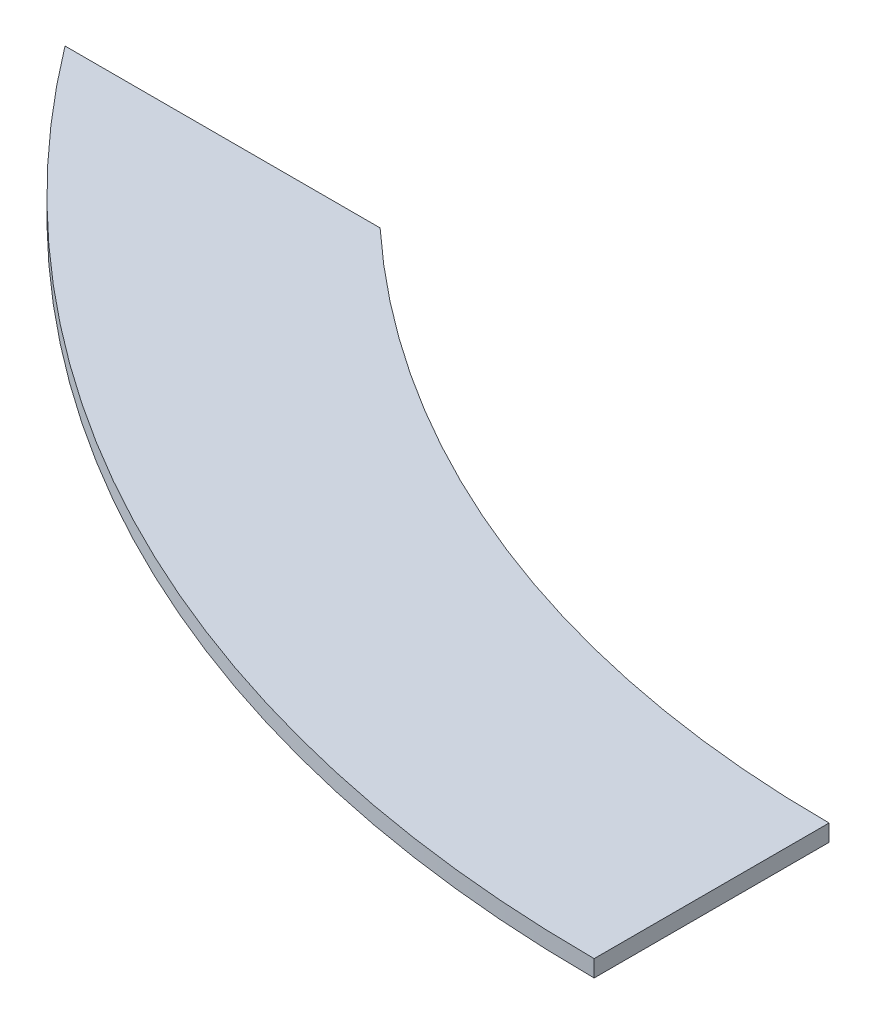
ISO-10303-21;
HEADER;
FILE_DESCRIPTION(('STEP AP214'),'2;1');
FILE_NAME('part.step','',(''),(''),'','','');
FILE_SCHEMA(('AUTOMOTIVE_DESIGN { 1 0 10303 214 1 1 1 1 }'));
ENDSEC;
DATA;
#1=APPLICATION_CONTEXT('core data for automotive mechanical design processes');
#2=APPLICATION_PROTOCOL_DEFINITION('international standard','automotive_design',2000,#1);
#3=PRODUCT_CONTEXT('',#1,'mechanical');
#4=PRODUCT('Part','Part','',(#3));
#5=PRODUCT_RELATED_PRODUCT_CATEGORY('part','',(#4));
#6=PRODUCT_DEFINITION_FORMATION('','',#4);
#7=PRODUCT_DEFINITION_CONTEXT('part definition',#1,'design');
#8=PRODUCT_DEFINITION('design','',#6,#7);
#9=PRODUCT_DEFINITION_SHAPE('','',#8);
#10=(LENGTH_UNIT() NAMED_UNIT(*) SI_UNIT(.MILLI.,.METRE.));
#11=(NAMED_UNIT(*) PLANE_ANGLE_UNIT() SI_UNIT($,.RADIAN.));
#12=(NAMED_UNIT(*) SI_UNIT($,.STERADIAN.) SOLID_ANGLE_UNIT());
#13=UNCERTAINTY_MEASURE_WITH_UNIT(LENGTH_MEASURE(1.E-05),#10,'distance_accuracy_value','');
#14=(GEOMETRIC_REPRESENTATION_CONTEXT(3) GLOBAL_UNCERTAINTY_ASSIGNED_CONTEXT((#13)) GLOBAL_UNIT_ASSIGNED_CONTEXT((#10,
#11,#12)) REPRESENTATION_CONTEXT('',''));
#15=CARTESIAN_POINT('',(0.,0.,0.));
#16=DIRECTION('',(0.,0.,1.));
#17=DIRECTION('',(1.,0.,0.));
#18=AXIS2_PLACEMENT_3D('',#15,#16,#17);
#19=CARTESIAN_POINT('',(0.,0.,301.));
#20=DIRECTION('',(0.,0.,-1.));
#21=DIRECTION('',(-1.,0.,0.));
#22=AXIS2_PLACEMENT_3D('',#19,#20,#21);
#23=PLANE('',#22);
#24=DIRECTION('',(-1.,0.,0.));
#25=VECTOR('',#24,1.);
#26=CARTESIAN_POINT('',(0.,6.35,301.));
#27=LINE('',#26,#25);
#28=CARTESIAN_POINT('',(-280.003946400761,6.35,301.));
#29=VERTEX_POINT('',#28);
#30=CARTESIAN_POINT('',(-399.248043201216,6.35,301.));
#31=VERTEX_POINT('',#30);
#32=EDGE_CURVE('E78',#29,#31,#27,.T.);
#33=ORIENTED_EDGE('',*,*,#32,.F.);
#34=DIRECTION('',(0.,-1.,0.));
#35=VECTOR('',#34,1.);
#36=CARTESIAN_POINT('',(-280.003946400761,6.35,301.));
#37=LINE('',#36,#35);
#38=CARTESIAN_POINT('',(-280.003946400761,0.,301.));
#39=VERTEX_POINT('',#38);
#40=EDGE_CURVE('E86',#39,#29,#37,.F.);
#41=ORIENTED_EDGE('',*,*,#40,.F.);
#42=DIRECTION('',(-1.,0.,0.));
#43=VECTOR('',#42,1.);
#44=CARTESIAN_POINT('',(0.,0.,301.));
#45=LINE('',#44,#43);
#46=CARTESIAN_POINT('',(-399.248043201216,0.,301.));
#47=VERTEX_POINT('',#46);
#48=EDGE_CURVE('E93',#39,#47,#45,.T.);
#49=ORIENTED_EDGE('',*,*,#48,.T.);
#50=DIRECTION('',(0.,-1.,0.));
#51=VECTOR('',#50,1.);
#52=CARTESIAN_POINT('',(-399.248043201216,6.35,301.));
#53=LINE('',#52,#51);
#54=EDGE_CURVE('E94',#47,#31,#53,.F.);
#55=ORIENTED_EDGE('',*,*,#54,.T.);
#56=EDGE_LOOP('',(#33,#41,#49,#55));
#57=FACE_BOUND('',#56,.T.);
#58=ADVANCED_FACE('F42',(#57),#23,.T.);
#59=CARTESIAN_POINT('',(0.,6.35,0.));
#60=DIRECTION('',(0.,-1.,0.));
#61=DIRECTION('',(0.,0.,-1.));
#62=AXIS2_PLACEMENT_3D('',#59,#60,#61);
#63=CYLINDRICAL_SURFACE('',#62,411.1);
#64=CARTESIAN_POINT('',(0.,0.,0.));
#65=DIRECTION('',(0.,1.,0.));
#66=DIRECTION('',(0.,0.,1.));
#67=AXIS2_PLACEMENT_3D('',#64,#65,#66);
#68=CIRCLE('',#67,411.1);
#69=CARTESIAN_POINT('',(0.,0.,411.1));
#70=VERTEX_POINT('',#69);
#71=EDGE_CURVE('E12',#39,#70,#68,.T.);
#72=ORIENTED_EDGE('',*,*,#71,.F.);
#73=ORIENTED_EDGE('',*,*,#40,.T.);
#74=CARTESIAN_POINT('',(0.,6.35,0.));
#75=DIRECTION('',(0.,1.,0.));
#76=DIRECTION('',(0.,0.,1.));
#77=AXIS2_PLACEMENT_3D('',#74,#75,#76);
#78=CIRCLE('',#77,411.1);
#79=CARTESIAN_POINT('',(0.,6.35,411.1));
#80=VERTEX_POINT('',#79);
#81=EDGE_CURVE('E69',#29,#80,#78,.T.);
#82=ORIENTED_EDGE('',*,*,#81,.T.);
#83=DIRECTION('',(0.,-1.,0.));
#84=VECTOR('',#83,1.);
#85=CARTESIAN_POINT('',(0.,6.35,411.1));
#86=LINE('',#85,#84);
#87=EDGE_CURVE('E87',#80,#70,#86,.T.);
#88=ORIENTED_EDGE('',*,*,#87,.T.);
#89=EDGE_LOOP('',(#72,#73,#82,#88));
#90=FACE_BOUND('',#89,.T.);
#91=ADVANCED_FACE('F85',(#90),#63,.F.);
#92=CARTESIAN_POINT('',(0.,6.35,0.));
#93=DIRECTION('',(0.,-1.,0.));
#94=DIRECTION('',(0.,0.,-1.));
#95=AXIS2_PLACEMENT_3D('',#92,#93,#94);
#96=CYLINDRICAL_SURFACE('',#95,500.);
#97=ORIENTED_EDGE('',*,*,#54,.F.);
#98=CARTESIAN_POINT('',(0.,0.,0.));
#99=DIRECTION('',(0.,1.,0.));
#100=DIRECTION('',(0.,0.,1.));
#101=AXIS2_PLACEMENT_3D('',#98,#99,#100);
#102=CIRCLE('',#101,500.);
#103=CARTESIAN_POINT('',(0.,0.,500.));
#104=VERTEX_POINT('',#103);
#105=EDGE_CURVE('E51',#47,#104,#102,.T.);
#106=ORIENTED_EDGE('',*,*,#105,.T.);
#107=DIRECTION('',(0.,-1.,0.));
#108=VECTOR('',#107,1.);
#109=CARTESIAN_POINT('',(0.,6.35,500.));
#110=LINE('',#109,#108);
#111=CARTESIAN_POINT('',(0.,6.35,500.));
#112=VERTEX_POINT('',#111);
#113=EDGE_CURVE('E110',#112,#104,#110,.T.);
#114=ORIENTED_EDGE('',*,*,#113,.F.);
#115=CARTESIAN_POINT('',(0.,6.35,0.));
#116=DIRECTION('',(0.,1.,0.));
#117=DIRECTION('',(0.,0.,1.));
#118=AXIS2_PLACEMENT_3D('',#115,#116,#117);
#119=CIRCLE('',#118,500.);
#120=EDGE_CURVE('E100',#31,#112,#119,.T.);
#121=ORIENTED_EDGE('',*,*,#120,.F.);
#122=EDGE_LOOP('',(#97,#106,#114,#121));
#123=FACE_BOUND('',#122,.T.);
#124=ADVANCED_FACE('F116',(#123),#96,.T.);
#125=CARTESIAN_POINT('',(0.,6.35,0.));
#126=DIRECTION('',(0.,1.,0.));
#127=DIRECTION('',(0.,0.,1.));
#128=AXIS2_PLACEMENT_3D('',#125,#126,#127);
#129=PLANE('',#128);
#130=ORIENTED_EDGE('',*,*,#81,.F.);
#131=ORIENTED_EDGE('',*,*,#32,.T.);
#132=ORIENTED_EDGE('',*,*,#120,.T.);
#133=DIRECTION('',(0.,0.,1.));
#134=VECTOR('',#133,1.);
#135=CARTESIAN_POINT('',(0.,6.35,0.));
#136=LINE('',#135,#134);
#137=EDGE_CURVE('E102',#80,#112,#136,.T.);
#138=ORIENTED_EDGE('',*,*,#137,.F.);
#139=EDGE_LOOP('',(#130,#131,#132,#138));
#140=FACE_BOUND('',#139,.T.);
#141=ADVANCED_FACE('F44',(#140),#129,.T.);
#142=CARTESIAN_POINT('',(0.,0.,0.));
#143=DIRECTION('',(0.,1.,0.));
#144=DIRECTION('',(0.,0.,1.));
#145=AXIS2_PLACEMENT_3D('',#142,#143,#144);
#146=PLANE('',#145);
#147=ORIENTED_EDGE('',*,*,#48,.F.);
#148=ORIENTED_EDGE('',*,*,#71,.T.);
#149=DIRECTION('',(0.,0.,1.));
#150=VECTOR('',#149,1.);
#151=CARTESIAN_POINT('',(0.,0.,0.));
#152=LINE('',#151,#150);
#153=EDGE_CURVE('E103',#70,#104,#152,.T.);
#154=ORIENTED_EDGE('',*,*,#153,.T.);
#155=ORIENTED_EDGE('',*,*,#105,.F.);
#156=EDGE_LOOP('',(#147,#148,#154,#155));
#157=FACE_BOUND('',#156,.T.);
#158=ADVANCED_FACE('F96',(#157),#146,.F.);
#159=CARTESIAN_POINT('',(0.,6.35,0.));
#160=DIRECTION('',(1.,0.,0.));
#161=DIRECTION('',(0.,0.,-1.));
#162=AXIS2_PLACEMENT_3D('',#159,#160,#161);
#163=PLANE('',#162);
#164=ORIENTED_EDGE('',*,*,#153,.F.);
#165=ORIENTED_EDGE('',*,*,#87,.F.);
#166=ORIENTED_EDGE('',*,*,#137,.T.);
#167=ORIENTED_EDGE('',*,*,#113,.T.);
#168=EDGE_LOOP('',(#164,#165,#166,#167));
#169=FACE_BOUND('',#168,.T.);
#170=ADVANCED_FACE('F113',(#169),#163,.T.);
#171=CLOSED_SHELL('',(#58,#91,#124,#141,#158,#170));
#172=MANIFOLD_SOLID_BREP('B2',#171);
#173=ADVANCED_BREP_SHAPE_REPRESENTATION('',(#18,#172),#14);
#174=SHAPE_DEFINITION_REPRESENTATION(#9,#173);
ENDSEC;
END-ISO-10303-21;
